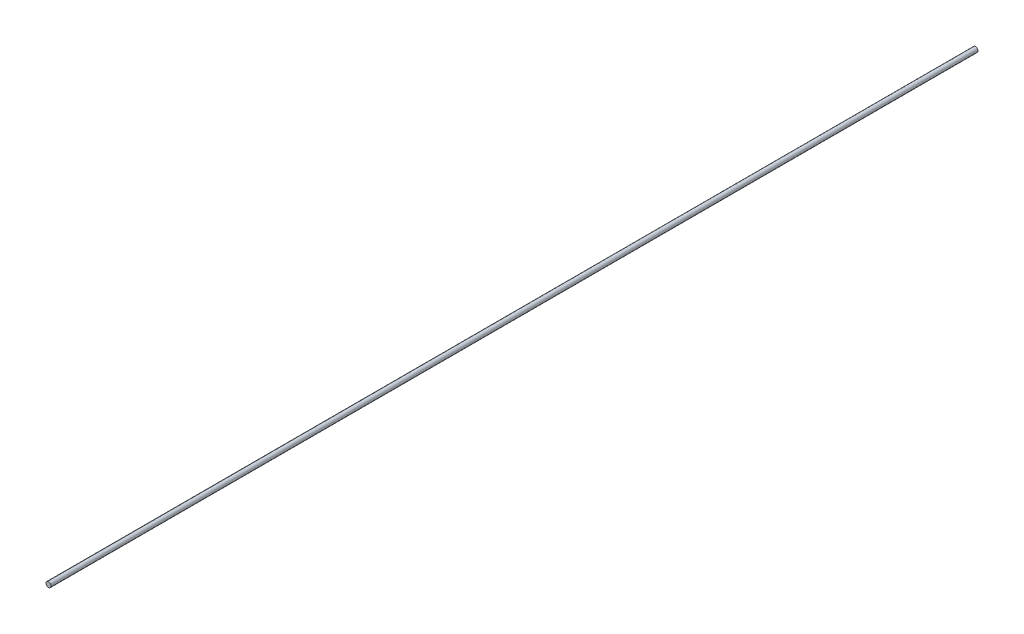
ISO-10303-21;
HEADER;
FILE_DESCRIPTION(('STEP AP214'),'2;1');
FILE_NAME('part.step','',(''),(''),'','','');
FILE_SCHEMA(('AUTOMOTIVE_DESIGN { 1 0 10303 214 1 1 1 1 }'));
ENDSEC;
DATA;
#1=APPLICATION_CONTEXT('core data for automotive mechanical design processes');
#2=APPLICATION_PROTOCOL_DEFINITION('international standard','automotive_design',2000,#1);
#3=PRODUCT_CONTEXT('',#1,'mechanical');
#4=PRODUCT('Part','Part','',(#3));
#5=PRODUCT_RELATED_PRODUCT_CATEGORY('part','',(#4));
#6=PRODUCT_DEFINITION_FORMATION('','',#4);
#7=PRODUCT_DEFINITION_CONTEXT('part definition',#1,'design');
#8=PRODUCT_DEFINITION('design','',#6,#7);
#9=PRODUCT_DEFINITION_SHAPE('','',#8);
#10=(LENGTH_UNIT() NAMED_UNIT(*) SI_UNIT(.MILLI.,.METRE.));
#11=(NAMED_UNIT(*) PLANE_ANGLE_UNIT() SI_UNIT($,.RADIAN.));
#12=(NAMED_UNIT(*) SI_UNIT($,.STERADIAN.) SOLID_ANGLE_UNIT());
#13=UNCERTAINTY_MEASURE_WITH_UNIT(LENGTH_MEASURE(1.E-05),#10,'distance_accuracy_value','');
#14=(GEOMETRIC_REPRESENTATION_CONTEXT(3) GLOBAL_UNCERTAINTY_ASSIGNED_CONTEXT((#13)) GLOBAL_UNIT_ASSIGNED_CONTEXT((#10,
#11,#12)) REPRESENTATION_CONTEXT('',''));
#15=CARTESIAN_POINT('',(0.,0.,0.));
#16=DIRECTION('',(0.,0.,1.));
#17=DIRECTION('',(1.,0.,0.));
#18=AXIS2_PLACEMENT_3D('',#15,#16,#17);
#19=CARTESIAN_POINT('',(0.,0.,2124.71));
#20=DIRECTION('',(0.,0.,-1.));
#21=DIRECTION('',(-1.,0.,0.));
#22=AXIS2_PLACEMENT_3D('',#19,#20,#21);
#23=CYLINDRICAL_SURFACE('',#22,5.715);
#24=CARTESIAN_POINT('',(0.,0.,2124.71));
#25=DIRECTION('',(0.,0.,1.));
#26=DIRECTION('',(1.,0.,0.));
#27=AXIS2_PLACEMENT_3D('',#24,#25,#26);
#28=CIRCLE('',#27,5.715);
#29=CARTESIAN_POINT('',(5.715,0.,2124.71));
#30=VERTEX_POINT('',#29);
#31=EDGE_CURVE('E10',#30,#30,#28,.T.);
#32=ORIENTED_EDGE('',*,*,#31,.F.);
#33=EDGE_LOOP('',(#32));
#34=FACE_BOUND('',#33,.T.);
#35=CARTESIAN_POINT('',(0.,0.,0.));
#36=DIRECTION('',(0.,0.,1.));
#37=DIRECTION('',(1.,0.,0.));
#38=AXIS2_PLACEMENT_3D('',#35,#36,#37);
#39=CIRCLE('',#38,5.715);
#40=CARTESIAN_POINT('',(5.715,0.,0.));
#41=VERTEX_POINT('',#40);
#42=EDGE_CURVE('E40',#41,#41,#39,.T.);
#43=ORIENTED_EDGE('',*,*,#42,.T.);
#44=EDGE_LOOP('',(#43));
#45=FACE_BOUND('',#44,.T.);
#46=ADVANCED_FACE('F37',(#34,#45),#23,.T.);
#47=CARTESIAN_POINT('',(0.,0.,2124.71));
#48=DIRECTION('',(0.,0.,1.));
#49=DIRECTION('',(1.,0.,0.));
#50=AXIS2_PLACEMENT_3D('',#47,#48,#49);
#51=PLANE('',#50);
#52=ORIENTED_EDGE('',*,*,#31,.T.);
#53=EDGE_LOOP('',(#52));
#54=FACE_BOUND('',#53,.T.);
#55=ADVANCED_FACE('F52',(#54),#51,.T.);
#56=CARTESIAN_POINT('',(0.,0.,0.));
#57=DIRECTION('',(0.,0.,1.));
#58=DIRECTION('',(1.,0.,0.));
#59=AXIS2_PLACEMENT_3D('',#56,#57,#58);
#60=PLANE('',#59);
#61=ORIENTED_EDGE('',*,*,#42,.F.);
#62=EDGE_LOOP('',(#61));
#63=FACE_BOUND('',#62,.T.);
#64=ADVANCED_FACE('F50',(#63),#60,.F.);
#65=CLOSED_SHELL('',(#46,#55,#64));
#66=MANIFOLD_SOLID_BREP('B2',#65);
#67=ADVANCED_BREP_SHAPE_REPRESENTATION('',(#18,#66),#14);
#68=SHAPE_DEFINITION_REPRESENTATION(#9,#67);
ENDSEC;
END-ISO-10303-21;
